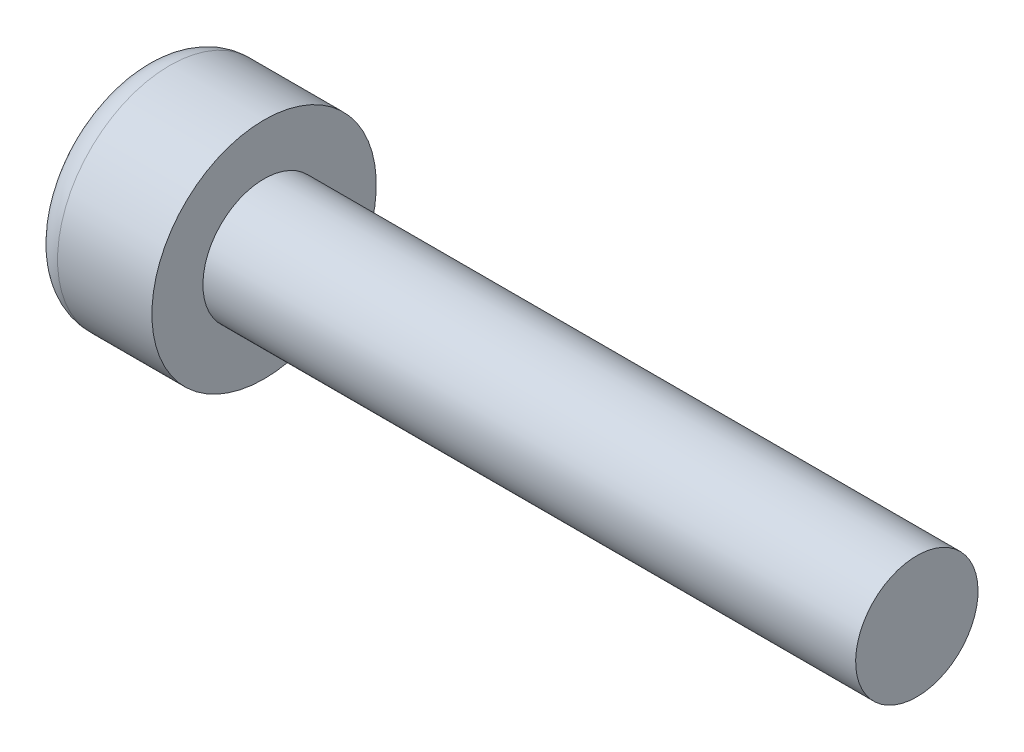
ISO-10303-21;
HEADER;
FILE_DESCRIPTION(('STEP AP214'),'2;1');
FILE_NAME('part.step','',(''),(''),'','','');
FILE_SCHEMA(('AUTOMOTIVE_DESIGN { 1 0 10303 214 1 1 1 1 }'));
ENDSEC;
DATA;
#1=APPLICATION_CONTEXT('core data for automotive mechanical design processes');
#2=APPLICATION_PROTOCOL_DEFINITION('international standard','automotive_design',2000,#1);
#3=PRODUCT_CONTEXT('',#1,'mechanical');
#4=PRODUCT('Part','Part','',(#3));
#5=PRODUCT_RELATED_PRODUCT_CATEGORY('part','',(#4));
#6=PRODUCT_DEFINITION_FORMATION('','',#4);
#7=PRODUCT_DEFINITION_CONTEXT('part definition',#1,'design');
#8=PRODUCT_DEFINITION('design','',#6,#7);
#9=PRODUCT_DEFINITION_SHAPE('','',#8);
#10=(LENGTH_UNIT() NAMED_UNIT(*) SI_UNIT(.MILLI.,.METRE.));
#11=(NAMED_UNIT(*) PLANE_ANGLE_UNIT() SI_UNIT($,.RADIAN.));
#12=(NAMED_UNIT(*) SI_UNIT($,.STERADIAN.) SOLID_ANGLE_UNIT());
#13=UNCERTAINTY_MEASURE_WITH_UNIT(LENGTH_MEASURE(1.E-05),#10,'distance_accuracy_value','');
#14=(GEOMETRIC_REPRESENTATION_CONTEXT(3) GLOBAL_UNCERTAINTY_ASSIGNED_CONTEXT((#13)) GLOBAL_UNIT_ASSIGNED_CONTEXT((#10,
#11,#12)) REPRESENTATION_CONTEXT('',''));
#15=CARTESIAN_POINT('',(0.,0.,0.));
#16=DIRECTION('',(0.,0.,1.));
#17=DIRECTION('',(1.,0.,0.));
#18=AXIS2_PLACEMENT_3D('',#15,#16,#17);
#19=CARTESIAN_POINT('',(0.,0.,0.));
#20=DIRECTION('',(1.,0.,0.));
#21=DIRECTION('',(0.,1.,0.));
#22=AXIS2_PLACEMENT_3D('',#19,#20,#21);
#23=PLANE('',#22);
#24=DIRECTION('',(0.,-0.5,-0.866025403784438));
#25=VECTOR('',#24,1.);
#26=CARTESIAN_POINT('',(0.,1.44337567297406,0.));
#27=LINE('',#26,#25);
#28=CARTESIAN_POINT('',(0.,1.44337567297406,0.));
#29=VERTEX_POINT('',#28);
#30=CARTESIAN_POINT('',(0.,0.721687836487031,-1.25));
#31=VERTEX_POINT('',#30);
#32=EDGE_CURVE('E121',#29,#31,#27,.T.);
#33=ORIENTED_EDGE('',*,*,#32,.F.);
#34=DIRECTION('',(0.,0.5,-0.866025403784439));
#35=VECTOR('',#34,1.);
#36=CARTESIAN_POINT('',(0.,0.721687836487032,1.25));
#37=LINE('',#36,#35);
#38=CARTESIAN_POINT('',(0.,0.721687836487032,1.25));
#39=VERTEX_POINT('',#38);
#40=EDGE_CURVE('E47',#39,#29,#37,.T.);
#41=ORIENTED_EDGE('',*,*,#40,.F.);
#42=DIRECTION('',(0.,1.,0.));
#43=VECTOR('',#42,1.);
#44=CARTESIAN_POINT('',(0.,-0.721687836487031,1.25));
#45=LINE('',#44,#43);
#46=CARTESIAN_POINT('',(0.,-0.721687836487031,1.25));
#47=VERTEX_POINT('',#46);
#48=EDGE_CURVE('E130',#47,#39,#45,.T.);
#49=ORIENTED_EDGE('',*,*,#48,.F.);
#50=DIRECTION('',(0.,0.5,0.866025403784439));
#51=VECTOR('',#50,1.);
#52=CARTESIAN_POINT('',(0.,-1.44337567297406,0.));
#53=LINE('',#52,#51);
#54=CARTESIAN_POINT('',(0.,-1.44337567297406,0.));
#55=VERTEX_POINT('',#54);
#56=EDGE_CURVE('E128',#55,#47,#53,.T.);
#57=ORIENTED_EDGE('',*,*,#56,.F.);
#58=DIRECTION('',(0.,-0.5,0.866025403784438));
#59=VECTOR('',#58,1.);
#60=CARTESIAN_POINT('',(0.,-0.721687836487032,-1.25));
#61=LINE('',#60,#59);
#62=CARTESIAN_POINT('',(0.,-0.721687836487032,-1.25));
#63=VERTEX_POINT('',#62);
#64=EDGE_CURVE('E95',#63,#55,#61,.T.);
#65=ORIENTED_EDGE('',*,*,#64,.F.);
#66=DIRECTION('',(0.,-1.,0.));
#67=VECTOR('',#66,1.);
#68=CARTESIAN_POINT('',(0.,0.721687836487031,-1.25));
#69=LINE('',#68,#67);
#70=EDGE_CURVE('E124',#31,#63,#69,.T.);
#71=ORIENTED_EDGE('',*,*,#70,.F.);
#72=EDGE_LOOP('',(#33,#41,#49,#57,#65,#71));
#73=FACE_BOUND('',#72,.T.);
#74=CARTESIAN_POINT('',(0.,0.,0.));
#75=DIRECTION('',(-1.,0.,0.));
#76=DIRECTION('',(0.,-1.,0.));
#77=AXIS2_PLACEMENT_3D('',#74,#75,#76);
#78=CIRCLE('',#77,2.0625);
#79=CARTESIAN_POINT('',(0.,-2.0625,0.));
#80=VERTEX_POINT('',#79);
#81=EDGE_CURVE('E11',#80,#80,#78,.T.);
#82=ORIENTED_EDGE('',*,*,#81,.T.);
#83=EDGE_LOOP('',(#82));
#84=FACE_BOUND('',#83,.T.);
#85=ADVANCED_FACE('F33',(#73,#84),#23,.F.);
#86=CARTESIAN_POINT('',(0.6875,0.,0.));
#87=DIRECTION('',(-1.,0.,0.));
#88=DIRECTION('',(0.,-1.,0.));
#89=AXIS2_PLACEMENT_3D('',#86,#87,#88);
#90=TOROIDAL_SURFACE('',#89,2.0625,0.6875);
#91=ORIENTED_EDGE('',*,*,#81,.F.);
#92=EDGE_LOOP('',(#91));
#93=FACE_BOUND('',#92,.T.);
#94=CARTESIAN_POINT('',(0.6875,0.,0.));
#95=DIRECTION('',(-1.,0.,0.));
#96=DIRECTION('',(0.,-1.,0.));
#97=AXIS2_PLACEMENT_3D('',#94,#95,#96);
#98=CIRCLE('',#97,2.75);
#99=CARTESIAN_POINT('',(0.687500000000001,-2.75,0.));
#100=VERTEX_POINT('',#99);
#101=EDGE_CURVE('E40',#100,#100,#98,.T.);
#102=ORIENTED_EDGE('',*,*,#101,.T.);
#103=EDGE_LOOP('',(#102));
#104=FACE_BOUND('',#103,.T.);
#105=ADVANCED_FACE('F150',(#93,#104),#90,.T.);
#106=CARTESIAN_POINT('',(0.,0.,0.));
#107=DIRECTION('',(-1.,0.,0.));
#108=DIRECTION('',(0.,-1.,0.));
#109=AXIS2_PLACEMENT_3D('',#106,#107,#108);
#110=CYLINDRICAL_SURFACE('',#109,2.75);
#111=ORIENTED_EDGE('',*,*,#101,.F.);
#112=EDGE_LOOP('',(#111));
#113=FACE_BOUND('',#112,.T.);
#114=CARTESIAN_POINT('',(3.,0.,0.));
#115=DIRECTION('',(-1.,0.,0.));
#116=DIRECTION('',(0.,-1.,0.));
#117=AXIS2_PLACEMENT_3D('',#114,#115,#116);
#118=CIRCLE('',#117,2.75);
#119=CARTESIAN_POINT('',(3.,-2.75,0.));
#120=VERTEX_POINT('',#119);
#121=EDGE_CURVE('E145',#120,#120,#118,.T.);
#122=ORIENTED_EDGE('',*,*,#121,.T.);
#123=EDGE_LOOP('',(#122));
#124=FACE_BOUND('',#123,.T.);
#125=ADVANCED_FACE('F152',(#113,#124),#110,.T.);
#126=CARTESIAN_POINT('',(3.,2.75,0.));
#127=DIRECTION('',(-1.,0.,0.));
#128=DIRECTION('',(0.,-1.,0.));
#129=AXIS2_PLACEMENT_3D('',#126,#127,#128);
#130=PLANE('',#129);
#131=ORIENTED_EDGE('',*,*,#121,.F.);
#132=EDGE_LOOP('',(#131));
#133=FACE_BOUND('',#132,.T.);
#134=CARTESIAN_POINT('',(3.,0.,0.));
#135=DIRECTION('',(-1.,0.,0.));
#136=DIRECTION('',(0.,-1.,0.));
#137=AXIS2_PLACEMENT_3D('',#134,#135,#136);
#138=CIRCLE('',#137,1.5);
#139=CARTESIAN_POINT('',(3.,-1.5,0.));
#140=VERTEX_POINT('',#139);
#141=EDGE_CURVE('E142',#140,#140,#138,.T.);
#142=ORIENTED_EDGE('',*,*,#141,.T.);
#143=EDGE_LOOP('',(#142));
#144=FACE_BOUND('',#143,.T.);
#145=ADVANCED_FACE('F155',(#133,#144),#130,.F.);
#146=CARTESIAN_POINT('',(0.,0.,0.));
#147=DIRECTION('',(-1.,0.,0.));
#148=DIRECTION('',(0.,-1.,0.));
#149=AXIS2_PLACEMENT_3D('',#146,#147,#148);
#150=CYLINDRICAL_SURFACE('',#149,1.5);
#151=ORIENTED_EDGE('',*,*,#141,.F.);
#152=EDGE_LOOP('',(#151));
#153=FACE_BOUND('',#152,.T.);
#154=CARTESIAN_POINT('',(19.,0.,0.));
#155=DIRECTION('',(-1.,0.,0.));
#156=DIRECTION('',(0.,-1.,0.));
#157=AXIS2_PLACEMENT_3D('',#154,#155,#156);
#158=CIRCLE('',#157,1.5);
#159=CARTESIAN_POINT('',(19.,-1.49999999999999,0.));
#160=VERTEX_POINT('',#159);
#161=EDGE_CURVE('E134',#160,#160,#158,.T.);
#162=ORIENTED_EDGE('',*,*,#161,.T.);
#163=EDGE_LOOP('',(#162));
#164=FACE_BOUND('',#163,.T.);
#165=ADVANCED_FACE('F161',(#153,#164),#150,.T.);
#166=CARTESIAN_POINT('',(19.,1.5,0.));
#167=DIRECTION('',(-1.,0.,0.));
#168=DIRECTION('',(0.,-1.,0.));
#169=AXIS2_PLACEMENT_3D('',#166,#167,#168);
#170=PLANE('',#169);
#171=ORIENTED_EDGE('',*,*,#161,.F.);
#172=EDGE_LOOP('',(#171));
#173=FACE_BOUND('',#172,.T.);
#174=ADVANCED_FACE('F167',(#173),#170,.F.);
#175=CARTESIAN_POINT('',(1.5,0.721687836487032,1.25));
#176=DIRECTION('',(0.,0.866025403784438,0.5));
#177=DIRECTION('',(0.,-0.5,0.866025403784439));
#178=AXIS2_PLACEMENT_3D('',#175,#176,#177);
#179=PLANE('',#178);
#180=ORIENTED_EDGE('',*,*,#40,.T.);
#181=DIRECTION('',(-1.,0.,0.));
#182=VECTOR('',#181,1.);
#183=CARTESIAN_POINT('',(1.5,1.44337567297406,0.));
#184=LINE('',#183,#182);
#185=CARTESIAN_POINT('',(1.5,1.44337567297406,0.));
#186=VERTEX_POINT('',#185);
#187=EDGE_CURVE('E77',#186,#29,#184,.T.);
#188=ORIENTED_EDGE('',*,*,#187,.F.);
#189=DIRECTION('',(0.,0.5,-0.866025403784439));
#190=VECTOR('',#189,1.);
#191=CARTESIAN_POINT('',(1.5,0.721687836487032,1.25));
#192=LINE('',#191,#190);
#193=CARTESIAN_POINT('',(1.5,0.721687836487032,1.25));
#194=VERTEX_POINT('',#193);
#195=EDGE_CURVE('E132',#194,#186,#192,.T.);
#196=ORIENTED_EDGE('',*,*,#195,.F.);
#197=DIRECTION('',(-1.,0.,0.));
#198=VECTOR('',#197,1.);
#199=CARTESIAN_POINT('',(1.5,0.721687836487032,1.25));
#200=LINE('',#199,#198);
#201=EDGE_CURVE('E55',#194,#39,#200,.T.);
#202=ORIENTED_EDGE('',*,*,#201,.T.);
#203=EDGE_LOOP('',(#180,#188,#196,#202));
#204=FACE_BOUND('',#203,.T.);
#205=ADVANCED_FACE('F172',(#204),#179,.F.);
#206=CARTESIAN_POINT('',(1.5,-0.721687836487031,1.25));
#207=DIRECTION('',(0.,0.,1.));
#208=DIRECTION('',(1.,0.,0.));
#209=AXIS2_PLACEMENT_3D('',#206,#207,#208);
#210=PLANE('',#209);
#211=ORIENTED_EDGE('',*,*,#48,.T.);
#212=ORIENTED_EDGE('',*,*,#201,.F.);
#213=DIRECTION('',(0.,1.,0.));
#214=VECTOR('',#213,1.);
#215=CARTESIAN_POINT('',(1.5,-0.721687836487031,1.25));
#216=LINE('',#215,#214);
#217=CARTESIAN_POINT('',(1.5,-0.721687836487031,1.25));
#218=VERTEX_POINT('',#217);
#219=EDGE_CURVE('E107',#218,#194,#216,.T.);
#220=ORIENTED_EDGE('',*,*,#219,.F.);
#221=DIRECTION('',(-1.,0.,0.));
#222=VECTOR('',#221,1.);
#223=CARTESIAN_POINT('',(1.5,-0.721687836487031,1.25));
#224=LINE('',#223,#222);
#225=EDGE_CURVE('E99',#218,#47,#224,.T.);
#226=ORIENTED_EDGE('',*,*,#225,.T.);
#227=EDGE_LOOP('',(#211,#212,#220,#226));
#228=FACE_BOUND('',#227,.T.);
#229=ADVANCED_FACE('F177',(#228),#210,.F.);
#230=CARTESIAN_POINT('',(1.5,-1.44337567297406,0.));
#231=DIRECTION('',(0.,-0.866025403784439,0.5));
#232=DIRECTION('',(0.,-0.5,-0.866025403784439));
#233=AXIS2_PLACEMENT_3D('',#230,#231,#232);
#234=PLANE('',#233);
#235=ORIENTED_EDGE('',*,*,#56,.T.);
#236=ORIENTED_EDGE('',*,*,#225,.F.);
#237=DIRECTION('',(0.,0.5,0.866025403784439));
#238=VECTOR('',#237,1.);
#239=CARTESIAN_POINT('',(1.5,-1.44337567297406,0.));
#240=LINE('',#239,#238);
#241=CARTESIAN_POINT('',(1.5,-1.44337567297406,0.));
#242=VERTEX_POINT('',#241);
#243=EDGE_CURVE('E103',#242,#218,#240,.T.);
#244=ORIENTED_EDGE('',*,*,#243,.F.);
#245=DIRECTION('',(-1.,0.,0.));
#246=VECTOR('',#245,1.);
#247=CARTESIAN_POINT('',(1.5,-1.44337567297406,0.));
#248=LINE('',#247,#246);
#249=EDGE_CURVE('E88',#242,#55,#248,.T.);
#250=ORIENTED_EDGE('',*,*,#249,.T.);
#251=EDGE_LOOP('',(#235,#236,#244,#250));
#252=FACE_BOUND('',#251,.T.);
#253=ADVANCED_FACE('F104',(#252),#234,.F.);
#254=CARTESIAN_POINT('',(1.5,-0.721687836487032,-1.25));
#255=DIRECTION('',(0.,-0.866025403784438,-0.5));
#256=DIRECTION('',(0.,0.5,-0.866025403784438));
#257=AXIS2_PLACEMENT_3D('',#254,#255,#256);
#258=PLANE('',#257);
#259=ORIENTED_EDGE('',*,*,#64,.T.);
#260=ORIENTED_EDGE('',*,*,#249,.F.);
#261=DIRECTION('',(0.,-0.5,0.866025403784438));
#262=VECTOR('',#261,1.);
#263=CARTESIAN_POINT('',(1.5,-0.721687836487032,-1.25));
#264=LINE('',#263,#262);
#265=CARTESIAN_POINT('',(1.5,-0.721687836487032,-1.25));
#266=VERTEX_POINT('',#265);
#267=EDGE_CURVE('E92',#266,#242,#264,.T.);
#268=ORIENTED_EDGE('',*,*,#267,.F.);
#269=DIRECTION('',(-1.,0.,0.));
#270=VECTOR('',#269,1.);
#271=CARTESIAN_POINT('',(1.5,-0.721687836487032,-1.25));
#272=LINE('',#271,#270);
#273=EDGE_CURVE('E100',#266,#63,#272,.T.);
#274=ORIENTED_EDGE('',*,*,#273,.T.);
#275=EDGE_LOOP('',(#259,#260,#268,#274));
#276=FACE_BOUND('',#275,.T.);
#277=ADVANCED_FACE('F90',(#276),#258,.F.);
#278=CARTESIAN_POINT('',(1.5,0.721687836487031,-1.25));
#279=DIRECTION('',(0.,0.,-1.));
#280=DIRECTION('',(-1.,0.,0.));
#281=AXIS2_PLACEMENT_3D('',#278,#279,#280);
#282=PLANE('',#281);
#283=ORIENTED_EDGE('',*,*,#70,.T.);
#284=ORIENTED_EDGE('',*,*,#273,.F.);
#285=DIRECTION('',(0.,-1.,0.));
#286=VECTOR('',#285,1.);
#287=CARTESIAN_POINT('',(1.5,0.721687836487031,-1.25));
#288=LINE('',#287,#286);
#289=CARTESIAN_POINT('',(1.5,0.721687836487031,-1.25));
#290=VERTEX_POINT('',#289);
#291=EDGE_CURVE('E113',#290,#266,#288,.T.);
#292=ORIENTED_EDGE('',*,*,#291,.F.);
#293=DIRECTION('',(-1.,0.,0.));
#294=VECTOR('',#293,1.);
#295=CARTESIAN_POINT('',(1.5,0.721687836487031,-1.25));
#296=LINE('',#295,#294);
#297=EDGE_CURVE('E137',#290,#31,#296,.T.);
#298=ORIENTED_EDGE('',*,*,#297,.T.);
#299=EDGE_LOOP('',(#283,#284,#292,#298));
#300=FACE_BOUND('',#299,.T.);
#301=ADVANCED_FACE('F203',(#300),#282,.F.);
#302=CARTESIAN_POINT('',(1.5,1.44337567297406,0.));
#303=DIRECTION('',(0.,0.866025403784438,-0.5));
#304=DIRECTION('',(0.,0.5,0.866025403784439));
#305=AXIS2_PLACEMENT_3D('',#302,#303,#304);
#306=PLANE('',#305);
#307=ORIENTED_EDGE('',*,*,#32,.T.);
#308=ORIENTED_EDGE('',*,*,#297,.F.);
#309=DIRECTION('',(0.,-0.5,-0.866025403784438));
#310=VECTOR('',#309,1.);
#311=CARTESIAN_POINT('',(1.5,1.44337567297406,0.));
#312=LINE('',#311,#310);
#313=EDGE_CURVE('E115',#186,#290,#312,.T.);
#314=ORIENTED_EDGE('',*,*,#313,.F.);
#315=ORIENTED_EDGE('',*,*,#187,.T.);
#316=EDGE_LOOP('',(#307,#308,#314,#315));
#317=FACE_BOUND('',#316,.T.);
#318=ADVANCED_FACE('F191',(#317),#306,.F.);
#319=CARTESIAN_POINT('',(1.5,0.,0.));
#320=DIRECTION('',(-1.,0.,0.));
#321=DIRECTION('',(0.,-1.,0.));
#322=AXIS2_PLACEMENT_3D('',#319,#320,#321);
#323=PLANE('',#322);
#324=ORIENTED_EDGE('',*,*,#195,.T.);
#325=ORIENTED_EDGE('',*,*,#313,.T.);
#326=ORIENTED_EDGE('',*,*,#291,.T.);
#327=ORIENTED_EDGE('',*,*,#267,.T.);
#328=ORIENTED_EDGE('',*,*,#243,.T.);
#329=ORIENTED_EDGE('',*,*,#219,.T.);
#330=EDGE_LOOP('',(#324,#325,#326,#327,#328,#329));
#331=FACE_BOUND('',#330,.T.);
#332=ADVANCED_FACE('F110',(#331),#323,.T.);
#333=CLOSED_SHELL('',(#85,#105,#125,#145,#165,#174,#205,#229,#253,#277,#301,#318,#332));
#334=MANIFOLD_SOLID_BREP('B2',#333);
#335=ADVANCED_BREP_SHAPE_REPRESENTATION('',(#18,#334),#14);
#336=SHAPE_DEFINITION_REPRESENTATION(#9,#335);
ENDSEC;
END-ISO-10303-21;
